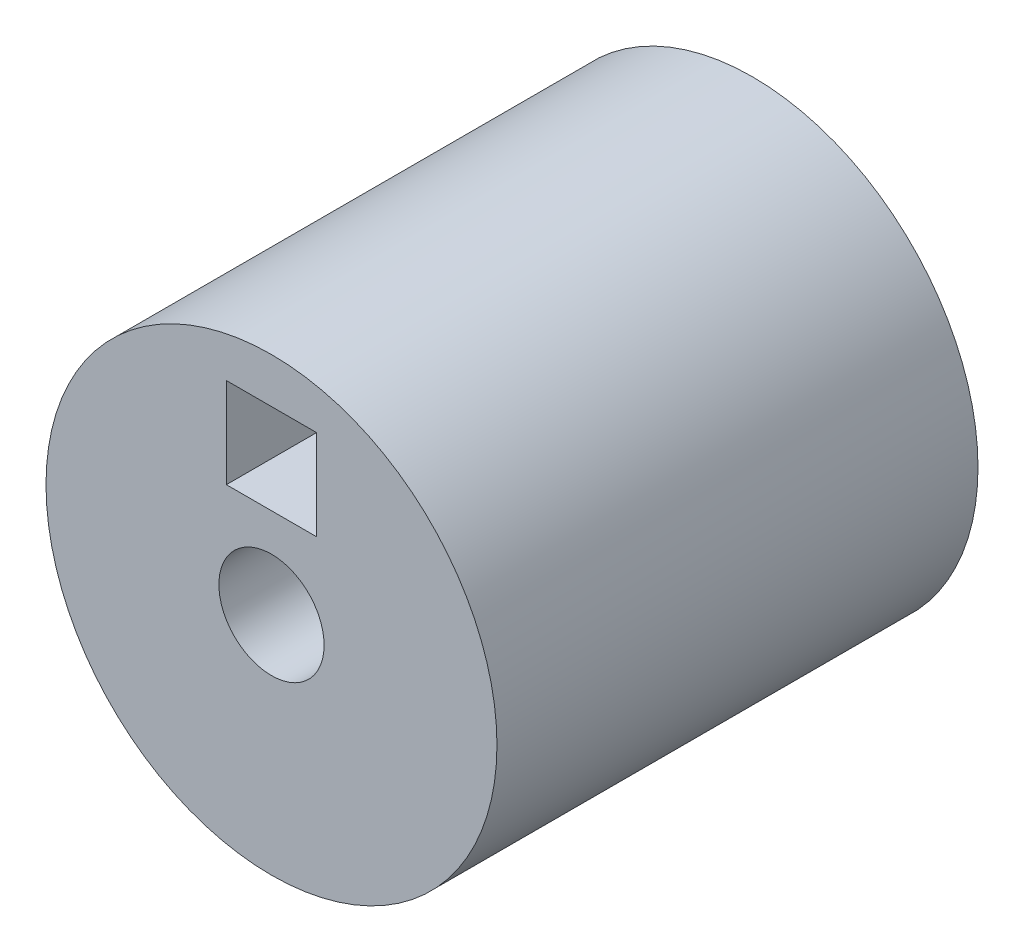
ISO-10303-21;
HEADER;
FILE_DESCRIPTION(('STEP AP214'),'2;1');
FILE_NAME('part.step','',(''),(''),'','','');
FILE_SCHEMA(('AUTOMOTIVE_DESIGN { 1 0 10303 214 1 1 1 1 }'));
ENDSEC;
DATA;
#1=APPLICATION_CONTEXT('core data for automotive mechanical design processes');
#2=APPLICATION_PROTOCOL_DEFINITION('international standard','automotive_design',2000,#1);
#3=PRODUCT_CONTEXT('',#1,'mechanical');
#4=PRODUCT('Part','Part','',(#3));
#5=PRODUCT_RELATED_PRODUCT_CATEGORY('part','',(#4));
#6=PRODUCT_DEFINITION_FORMATION('','',#4);
#7=PRODUCT_DEFINITION_CONTEXT('part definition',#1,'design');
#8=PRODUCT_DEFINITION('design','',#6,#7);
#9=PRODUCT_DEFINITION_SHAPE('','',#8);
#10=(LENGTH_UNIT() NAMED_UNIT(*) SI_UNIT(.MILLI.,.METRE.));
#11=(NAMED_UNIT(*) PLANE_ANGLE_UNIT() SI_UNIT($,.RADIAN.));
#12=(NAMED_UNIT(*) SI_UNIT($,.STERADIAN.) SOLID_ANGLE_UNIT());
#13=UNCERTAINTY_MEASURE_WITH_UNIT(LENGTH_MEASURE(1.E-05),#10,'distance_accuracy_value','');
#14=(GEOMETRIC_REPRESENTATION_CONTEXT(3) GLOBAL_UNCERTAINTY_ASSIGNED_CONTEXT((#13)) GLOBAL_UNIT_ASSIGNED_CONTEXT((#10,
#11,#12)) REPRESENTATION_CONTEXT('',''));
#15=CARTESIAN_POINT('',(0.,0.,0.));
#16=DIRECTION('',(0.,0.,1.));
#17=DIRECTION('',(1.,0.,0.));
#18=AXIS2_PLACEMENT_3D('',#15,#16,#17);
#19=CARTESIAN_POINT('',(0.,0.,16.));
#20=DIRECTION('',(0.,0.,1.));
#21=DIRECTION('',(1.,0.,0.));
#22=AXIS2_PLACEMENT_3D('',#19,#20,#21);
#23=PLANE('',#22);
#24=DIRECTION('',(0.,1.,0.));
#25=VECTOR('',#24,1.);
#26=CARTESIAN_POINT('',(1.5,3.,16.));
#27=LINE('',#26,#25);
#28=CARTESIAN_POINT('',(1.5,3.,16.));
#29=VERTEX_POINT('',#28);
#30=CARTESIAN_POINT('',(1.5,6.,16.));
#31=VERTEX_POINT('',#30);
#32=EDGE_CURVE('E61',#29,#31,#27,.T.);
#33=ORIENTED_EDGE('',*,*,#32,.F.);
#34=DIRECTION('',(1.,0.,0.));
#35=VECTOR('',#34,1.);
#36=CARTESIAN_POINT('',(-1.5,3.,16.));
#37=LINE('',#36,#35);
#38=CARTESIAN_POINT('',(-1.5,3.,16.));
#39=VERTEX_POINT('',#38);
#40=EDGE_CURVE('E145',#39,#29,#37,.T.);
#41=ORIENTED_EDGE('',*,*,#40,.F.);
#42=DIRECTION('',(0.,-1.,0.));
#43=VECTOR('',#42,1.);
#44=CARTESIAN_POINT('',(-1.5,3.,16.));
#45=LINE('',#44,#43);
#46=CARTESIAN_POINT('',(-1.5,6.,16.));
#47=VERTEX_POINT('',#46);
#48=EDGE_CURVE('E159',#47,#39,#45,.T.);
#49=ORIENTED_EDGE('',*,*,#48,.F.);
#50=DIRECTION('',(-1.,0.,0.));
#51=VECTOR('',#50,1.);
#52=CARTESIAN_POINT('',(-1.5,6.,16.));
#53=LINE('',#52,#51);
#54=EDGE_CURVE('E156',#31,#47,#53,.T.);
#55=ORIENTED_EDGE('',*,*,#54,.F.);
#56=EDGE_LOOP('',(#33,#41,#49,#55));
#57=FACE_BOUND('',#56,.T.);
#58=CARTESIAN_POINT('',(0.,0.,16.));
#59=DIRECTION('',(0.,0.,1.));
#60=DIRECTION('',(1.,0.,0.));
#61=AXIS2_PLACEMENT_3D('',#58,#59,#60);
#62=CIRCLE('',#61,7.5);
#63=CARTESIAN_POINT('',(7.5,0.,16.));
#64=VERTEX_POINT('',#63);
#65=EDGE_CURVE('E11',#64,#64,#62,.T.);
#66=ORIENTED_EDGE('',*,*,#65,.T.);
#67=EDGE_LOOP('',(#66));
#68=FACE_BOUND('',#67,.T.);
#69=CARTESIAN_POINT('',(0.,0.,16.));
#70=DIRECTION('',(0.,0.,1.));
#71=DIRECTION('',(1.,0.,0.));
#72=AXIS2_PLACEMENT_3D('',#69,#70,#71);
#73=CIRCLE('',#72,1.75);
#74=CARTESIAN_POINT('',(1.75,0.,16.));
#75=VERTEX_POINT('',#74);
#76=EDGE_CURVE('E172',#75,#75,#73,.T.);
#77=ORIENTED_EDGE('',*,*,#76,.F.);
#78=EDGE_LOOP('',(#77));
#79=FACE_BOUND('',#78,.T.);
#80=ADVANCED_FACE('F38',(#57,#68,#79),#23,.T.);
#81=CARTESIAN_POINT('',(0.,0.,0.));
#82=DIRECTION('',(0.,0.,1.));
#83=DIRECTION('',(1.,0.,0.));
#84=AXIS2_PLACEMENT_3D('',#81,#82,#83);
#85=PLANE('',#84);
#86=DIRECTION('',(0.309016994374946,0.951056516295154,0.));
#87=VECTOR('',#86,1.);
#88=CARTESIAN_POINT('',(-5.24281360620851,3.2806867406924,0.));
#89=LINE('',#88,#87);
#90=CARTESIAN_POINT('',(-6.16986458933335,0.427517191806938,0.));
#91=VERTEX_POINT('',#90);
#92=CARTESIAN_POINT('',(-5.24281360620851,3.2806867406924,0.));
#93=VERTEX_POINT('',#92);
#94=EDGE_CURVE('E132',#91,#93,#89,.T.);
#95=ORIENTED_EDGE('',*,*,#94,.F.);
#96=DIRECTION('',(-0.951056516295154,0.309016994374945,0.));
#97=VECTOR('',#96,1.);
#98=CARTESIAN_POINT('',(-6.16986458933335,0.427517191806938,0.));
#99=LINE('',#98,#97);
#100=CARTESIAN_POINT('',(-3.31669504044788,-0.499533791317898,0.));
#101=VERTEX_POINT('',#100);
#102=EDGE_CURVE('E53',#101,#91,#99,.T.);
#103=ORIENTED_EDGE('',*,*,#102,.F.);
#104=DIRECTION('',(-0.309016994374945,-0.951056516295154,0.));
#105=VECTOR('',#104,1.);
#106=CARTESIAN_POINT('',(-3.31669504044788,-0.499533791317898,0.));
#107=LINE('',#106,#105);
#108=CARTESIAN_POINT('',(-2.38964405732305,2.35363575756757,0.));
#109=VERTEX_POINT('',#108);
#110=EDGE_CURVE('E123',#109,#101,#107,.T.);
#111=ORIENTED_EDGE('',*,*,#110,.F.);
#112=DIRECTION('',(0.951056516295154,-0.309016994374945,0.));
#113=VECTOR('',#112,1.);
#114=CARTESIAN_POINT('',(-2.38964405732305,2.35363575756757,0.));
#115=LINE('',#114,#113);
#116=EDGE_CURVE('E126',#93,#109,#115,.T.);
#117=ORIENTED_EDGE('',*,*,#116,.F.);
#118=EDGE_LOOP('',(#95,#103,#111,#117));
#119=FACE_BOUND('',#118,.T.);
#120=CARTESIAN_POINT('',(0.,0.,0.));
#121=DIRECTION('',(0.,0.,1.));
#122=DIRECTION('',(1.,0.,0.));
#123=AXIS2_PLACEMENT_3D('',#120,#121,#122);
#124=CIRCLE('',#123,7.5);
#125=CARTESIAN_POINT('',(7.5,0.,0.));
#126=VERTEX_POINT('',#125);
#127=EDGE_CURVE('E42',#126,#126,#124,.T.);
#128=ORIENTED_EDGE('',*,*,#127,.F.);
#129=EDGE_LOOP('',(#128));
#130=FACE_BOUND('',#129,.T.);
#131=CARTESIAN_POINT('',(0.,0.,0.));
#132=DIRECTION('',(0.,0.,1.));
#133=DIRECTION('',(1.,0.,0.));
#134=AXIS2_PLACEMENT_3D('',#131,#132,#133);
#135=CIRCLE('',#134,1.75);
#136=CARTESIAN_POINT('',(1.75,0.,0.));
#137=VERTEX_POINT('',#136);
#138=EDGE_CURVE('E166',#137,#137,#135,.T.);
#139=ORIENTED_EDGE('',*,*,#138,.T.);
#140=EDGE_LOOP('',(#139));
#141=FACE_BOUND('',#140,.T.);
#142=ADVANCED_FACE('F178',(#119,#130,#141),#85,.F.);
#143=CARTESIAN_POINT('',(0.,0.,16.));
#144=DIRECTION('',(0.,0.,-1.));
#145=DIRECTION('',(-1.,0.,0.));
#146=AXIS2_PLACEMENT_3D('',#143,#144,#145);
#147=CYLINDRICAL_SURFACE('',#146,7.5);
#148=ORIENTED_EDGE('',*,*,#65,.F.);
#149=EDGE_LOOP('',(#148));
#150=FACE_BOUND('',#149,.T.);
#151=ORIENTED_EDGE('',*,*,#127,.T.);
#152=EDGE_LOOP('',(#151));
#153=FACE_BOUND('',#152,.T.);
#154=ADVANCED_FACE('F40',(#150,#153),#147,.T.);
#155=CARTESIAN_POINT('',(0.,0.,16.));
#156=DIRECTION('',(0.,0.,-1.));
#157=DIRECTION('',(-1.,0.,0.));
#158=AXIS2_PLACEMENT_3D('',#155,#156,#157);
#159=CYLINDRICAL_SURFACE('',#158,1.75);
#160=ORIENTED_EDGE('',*,*,#76,.T.);
#161=EDGE_LOOP('',(#160));
#162=FACE_BOUND('',#161,.T.);
#163=ORIENTED_EDGE('',*,*,#138,.F.);
#164=EDGE_LOOP('',(#163));
#165=FACE_BOUND('',#164,.T.);
#166=ADVANCED_FACE('F180',(#162,#165),#159,.F.);
#167=CARTESIAN_POINT('',(1.5,3.,8.));
#168=DIRECTION('',(1.,0.,0.));
#169=DIRECTION('',(0.,0.,-1.));
#170=AXIS2_PLACEMENT_3D('',#167,#168,#169);
#171=PLANE('',#170);
#172=ORIENTED_EDGE('',*,*,#32,.T.);
#173=DIRECTION('',(0.,0.,1.));
#174=VECTOR('',#173,1.);
#175=CARTESIAN_POINT('',(1.5,6.,8.));
#176=LINE('',#175,#174);
#177=CARTESIAN_POINT('',(1.5,6.,8.));
#178=VERTEX_POINT('',#177);
#179=EDGE_CURVE('E154',#178,#31,#176,.T.);
#180=ORIENTED_EDGE('',*,*,#179,.F.);
#181=DIRECTION('',(0.,1.,0.));
#182=VECTOR('',#181,1.);
#183=CARTESIAN_POINT('',(1.5,3.,8.));
#184=LINE('',#183,#182);
#185=CARTESIAN_POINT('',(1.5,3.,8.));
#186=VERTEX_POINT('',#185);
#187=EDGE_CURVE('E141',#186,#178,#184,.T.);
#188=ORIENTED_EDGE('',*,*,#187,.F.);
#189=DIRECTION('',(0.,0.,1.));
#190=VECTOR('',#189,1.);
#191=CARTESIAN_POINT('',(1.5,3.,8.));
#192=LINE('',#191,#190);
#193=EDGE_CURVE('E164',#186,#29,#192,.T.);
#194=ORIENTED_EDGE('',*,*,#193,.T.);
#195=EDGE_LOOP('',(#172,#180,#188,#194));
#196=FACE_BOUND('',#195,.T.);
#197=ADVANCED_FACE('F182',(#196),#171,.F.);
#198=CARTESIAN_POINT('',(-1.5,3.,8.));
#199=DIRECTION('',(0.,-1.,0.));
#200=DIRECTION('',(0.,0.,-1.));
#201=AXIS2_PLACEMENT_3D('',#198,#199,#200);
#202=PLANE('',#201);
#203=ORIENTED_EDGE('',*,*,#40,.T.);
#204=ORIENTED_EDGE('',*,*,#193,.F.);
#205=DIRECTION('',(1.,0.,0.));
#206=VECTOR('',#205,1.);
#207=CARTESIAN_POINT('',(-1.5,3.,8.));
#208=LINE('',#207,#206);
#209=CARTESIAN_POINT('',(-1.5,3.,8.));
#210=VERTEX_POINT('',#209);
#211=EDGE_CURVE('E151',#210,#186,#208,.T.);
#212=ORIENTED_EDGE('',*,*,#211,.F.);
#213=DIRECTION('',(0.,0.,1.));
#214=VECTOR('',#213,1.);
#215=CARTESIAN_POINT('',(-1.5,3.,8.));
#216=LINE('',#215,#214);
#217=EDGE_CURVE('E167',#210,#39,#216,.T.);
#218=ORIENTED_EDGE('',*,*,#217,.T.);
#219=EDGE_LOOP('',(#203,#204,#212,#218));
#220=FACE_BOUND('',#219,.T.);
#221=ADVANCED_FACE('F190',(#220),#202,.F.);
#222=CARTESIAN_POINT('',(-1.5,3.,8.));
#223=DIRECTION('',(-1.,0.,0.));
#224=DIRECTION('',(0.,0.,1.));
#225=AXIS2_PLACEMENT_3D('',#222,#223,#224);
#226=PLANE('',#225);
#227=ORIENTED_EDGE('',*,*,#48,.T.);
#228=ORIENTED_EDGE('',*,*,#217,.F.);
#229=DIRECTION('',(0.,-1.,0.));
#230=VECTOR('',#229,1.);
#231=CARTESIAN_POINT('',(-1.5,3.,8.));
#232=LINE('',#231,#230);
#233=CARTESIAN_POINT('',(-1.5,6.,8.));
#234=VERTEX_POINT('',#233);
#235=EDGE_CURVE('E148',#234,#210,#232,.T.);
#236=ORIENTED_EDGE('',*,*,#235,.F.);
#237=DIRECTION('',(0.,0.,1.));
#238=VECTOR('',#237,1.);
#239=CARTESIAN_POINT('',(-1.5,6.,8.));
#240=LINE('',#239,#238);
#241=EDGE_CURVE('E169',#234,#47,#240,.T.);
#242=ORIENTED_EDGE('',*,*,#241,.T.);
#243=EDGE_LOOP('',(#227,#228,#236,#242));
#244=FACE_BOUND('',#243,.T.);
#245=ADVANCED_FACE('F220',(#244),#226,.F.);
#246=CARTESIAN_POINT('',(-1.5,6.,8.));
#247=DIRECTION('',(0.,1.,0.));
#248=DIRECTION('',(0.,0.,1.));
#249=AXIS2_PLACEMENT_3D('',#246,#247,#248);
#250=PLANE('',#249);
#251=ORIENTED_EDGE('',*,*,#54,.T.);
#252=ORIENTED_EDGE('',*,*,#241,.F.);
#253=DIRECTION('',(-1.,0.,0.));
#254=VECTOR('',#253,1.);
#255=CARTESIAN_POINT('',(-1.5,6.,8.));
#256=LINE('',#255,#254);
#257=EDGE_CURVE('E144',#178,#234,#256,.T.);
#258=ORIENTED_EDGE('',*,*,#257,.F.);
#259=ORIENTED_EDGE('',*,*,#179,.T.);
#260=EDGE_LOOP('',(#251,#252,#258,#259));
#261=FACE_BOUND('',#260,.T.);
#262=ADVANCED_FACE('F211',(#261),#250,.F.);
#263=CARTESIAN_POINT('',(0.,0.,8.));
#264=DIRECTION('',(0.,0.,-1.));
#265=DIRECTION('',(-1.,0.,0.));
#266=AXIS2_PLACEMENT_3D('',#263,#264,#265);
#267=PLANE('',#266);
#268=ORIENTED_EDGE('',*,*,#187,.T.);
#269=ORIENTED_EDGE('',*,*,#257,.T.);
#270=ORIENTED_EDGE('',*,*,#235,.T.);
#271=ORIENTED_EDGE('',*,*,#211,.T.);
#272=EDGE_LOOP('',(#268,#269,#270,#271));
#273=FACE_BOUND('',#272,.T.);
#274=ADVANCED_FACE('F217',(#273),#267,.F.);
#275=CARTESIAN_POINT('',(-6.16986458933335,0.427517191806938,8.));
#276=DIRECTION('',(-0.309016994374945,-0.951056516295154,0.));
#277=DIRECTION('',(0.951056516295154,-0.309016994374945,0.));
#278=AXIS2_PLACEMENT_3D('',#275,#276,#277);
#279=PLANE('',#278);
#280=ORIENTED_EDGE('',*,*,#102,.T.);
#281=DIRECTION('',(0.,0.,-1.));
#282=VECTOR('',#281,1.);
#283=CARTESIAN_POINT('',(-6.16986458933335,0.427517191806938,8.));
#284=LINE('',#283,#282);
#285=CARTESIAN_POINT('',(-6.16986458933335,0.427517191806938,8.));
#286=VERTEX_POINT('',#285);
#287=EDGE_CURVE('E101',#286,#91,#284,.T.);
#288=ORIENTED_EDGE('',*,*,#287,.F.);
#289=DIRECTION('',(-0.951056516295154,0.309016994374945,0.));
#290=VECTOR('',#289,1.);
#291=CARTESIAN_POINT('',(-6.16986458933335,0.427517191806938,8.));
#292=LINE('',#291,#290);
#293=CARTESIAN_POINT('',(-3.31669504044788,-0.499533791317898,8.));
#294=VERTEX_POINT('',#293);
#295=EDGE_CURVE('E105',#294,#286,#292,.T.);
#296=ORIENTED_EDGE('',*,*,#295,.F.);
#297=DIRECTION('',(0.,0.,-1.));
#298=VECTOR('',#297,1.);
#299=CARTESIAN_POINT('',(-3.31669504044788,-0.499533791317898,8.));
#300=LINE('',#299,#298);
#301=EDGE_CURVE('E136',#294,#101,#300,.T.);
#302=ORIENTED_EDGE('',*,*,#301,.T.);
#303=EDGE_LOOP('',(#280,#288,#296,#302));
#304=FACE_BOUND('',#303,.T.);
#305=ADVANCED_FACE('F103',(#304),#279,.F.);
#306=CARTESIAN_POINT('',(-3.31669504044788,-0.499533791317898,8.));
#307=DIRECTION('',(0.951056516295154,-0.309016994374945,0.));
#308=DIRECTION('',(0.309016994374945,0.951056516295154,0.));
#309=AXIS2_PLACEMENT_3D('',#306,#307,#308);
#310=PLANE('',#309);
#311=ORIENTED_EDGE('',*,*,#110,.T.);
#312=ORIENTED_EDGE('',*,*,#301,.F.);
#313=DIRECTION('',(-0.309016994374945,-0.951056516295154,0.));
#314=VECTOR('',#313,1.);
#315=CARTESIAN_POINT('',(-3.31669504044788,-0.499533791317898,8.));
#316=LINE('',#315,#314);
#317=CARTESIAN_POINT('',(-2.38964405732305,2.35363575756757,8.));
#318=VERTEX_POINT('',#317);
#319=EDGE_CURVE('E111',#318,#294,#316,.T.);
#320=ORIENTED_EDGE('',*,*,#319,.F.);
#321=DIRECTION('',(0.,0.,-1.));
#322=VECTOR('',#321,1.);
#323=CARTESIAN_POINT('',(-2.38964405732305,2.35363575756757,8.));
#324=LINE('',#323,#322);
#325=EDGE_CURVE('E138',#318,#109,#324,.T.);
#326=ORIENTED_EDGE('',*,*,#325,.T.);
#327=EDGE_LOOP('',(#311,#312,#320,#326));
#328=FACE_BOUND('',#327,.T.);
#329=ADVANCED_FACE('F234',(#328),#310,.F.);
#330=CARTESIAN_POINT('',(-2.38964405732305,2.35363575756757,8.));
#331=DIRECTION('',(0.309016994374945,0.951056516295154,0.));
#332=DIRECTION('',(-0.951056516295155,0.309016994374945,0.));
#333=AXIS2_PLACEMENT_3D('',#330,#331,#332);
#334=PLANE('',#333);
#335=ORIENTED_EDGE('',*,*,#116,.T.);
#336=ORIENTED_EDGE('',*,*,#325,.F.);
#337=DIRECTION('',(0.951056516295154,-0.309016994374945,0.));
#338=VECTOR('',#337,1.);
#339=CARTESIAN_POINT('',(-2.38964405732305,2.35363575756757,8.));
#340=LINE('',#339,#338);
#341=CARTESIAN_POINT('',(-5.24281360620851,3.2806867406924,8.));
#342=VERTEX_POINT('',#341);
#343=EDGE_CURVE('E119',#342,#318,#340,.T.);
#344=ORIENTED_EDGE('',*,*,#343,.F.);
#345=DIRECTION('',(0.,0.,-1.));
#346=VECTOR('',#345,1.);
#347=CARTESIAN_POINT('',(-5.24281360620851,3.2806867406924,8.));
#348=LINE('',#347,#346);
#349=EDGE_CURVE('E110',#342,#93,#348,.T.);
#350=ORIENTED_EDGE('',*,*,#349,.T.);
#351=EDGE_LOOP('',(#335,#336,#344,#350));
#352=FACE_BOUND('',#351,.T.);
#353=ADVANCED_FACE('F237',(#352),#334,.F.);
#354=CARTESIAN_POINT('',(-5.24281360620851,3.2806867406924,8.));
#355=DIRECTION('',(-0.951056516295154,0.309016994374946,0.));
#356=DIRECTION('',(-0.309016994374946,-0.951056516295154,0.));
#357=AXIS2_PLACEMENT_3D('',#354,#355,#356);
#358=PLANE('',#357);
#359=ORIENTED_EDGE('',*,*,#94,.T.);
#360=ORIENTED_EDGE('',*,*,#349,.F.);
#361=DIRECTION('',(0.309016994374946,0.951056516295154,0.));
#362=VECTOR('',#361,1.);
#363=CARTESIAN_POINT('',(-5.24281360620851,3.2806867406924,8.));
#364=LINE('',#363,#362);
#365=EDGE_CURVE('E114',#286,#342,#364,.T.);
#366=ORIENTED_EDGE('',*,*,#365,.F.);
#367=ORIENTED_EDGE('',*,*,#287,.T.);
#368=EDGE_LOOP('',(#359,#360,#366,#367));
#369=FACE_BOUND('',#368,.T.);
#370=ADVANCED_FACE('F115',(#369),#358,.F.);
#371=CARTESIAN_POINT('',(0.,0.,8.));
#372=DIRECTION('',(0.,0.,1.));
#373=DIRECTION('',(1.,0.,0.));
#374=AXIS2_PLACEMENT_3D('',#371,#372,#373);
#375=PLANE('',#374);
#376=ORIENTED_EDGE('',*,*,#295,.T.);
#377=ORIENTED_EDGE('',*,*,#365,.T.);
#378=ORIENTED_EDGE('',*,*,#343,.T.);
#379=ORIENTED_EDGE('',*,*,#319,.T.);
#380=EDGE_LOOP('',(#376,#377,#378,#379));
#381=FACE_BOUND('',#380,.T.);
#382=ADVANCED_FACE('F121',(#381),#375,.F.);
#383=CLOSED_SHELL('',(#80,#142,#154,#166,#197,#221,#245,#262,#274,#305,#329,#353,#370,#382));
#384=MANIFOLD_SOLID_BREP('B2',#383);
#385=ADVANCED_BREP_SHAPE_REPRESENTATION('',(#18,#384),#14);
#386=SHAPE_DEFINITION_REPRESENTATION(#9,#385);
ENDSEC;
END-ISO-10303-21;
